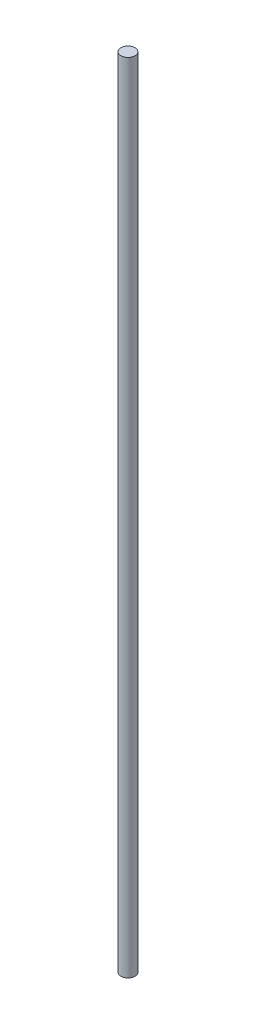
ISO-10303-21;
HEADER;
FILE_DESCRIPTION(('STEP AP214'),'2;1');
FILE_NAME('part.step','',(''),(''),'','','');
FILE_SCHEMA(('AUTOMOTIVE_DESIGN { 1 0 10303 214 1 1 1 1 }'));
ENDSEC;
DATA;
#1=APPLICATION_CONTEXT('core data for automotive mechanical design processes');
#2=APPLICATION_PROTOCOL_DEFINITION('international standard','automotive_design',2000,#1);
#3=PRODUCT_CONTEXT('',#1,'mechanical');
#4=PRODUCT('Part','Part','',(#3));
#5=PRODUCT_RELATED_PRODUCT_CATEGORY('part','',(#4));
#6=PRODUCT_DEFINITION_FORMATION('','',#4);
#7=PRODUCT_DEFINITION_CONTEXT('part definition',#1,'design');
#8=PRODUCT_DEFINITION('design','',#6,#7);
#9=PRODUCT_DEFINITION_SHAPE('','',#8);
#10=(LENGTH_UNIT() NAMED_UNIT(*) SI_UNIT(.MILLI.,.METRE.));
#11=(NAMED_UNIT(*) PLANE_ANGLE_UNIT() SI_UNIT($,.RADIAN.));
#12=(NAMED_UNIT(*) SI_UNIT($,.STERADIAN.) SOLID_ANGLE_UNIT());
#13=UNCERTAINTY_MEASURE_WITH_UNIT(LENGTH_MEASURE(1.E-05),#10,'distance_accuracy_value','');
#14=(GEOMETRIC_REPRESENTATION_CONTEXT(3) GLOBAL_UNCERTAINTY_ASSIGNED_CONTEXT((#13)) GLOBAL_UNIT_ASSIGNED_CONTEXT((#10,
#11,#12)) REPRESENTATION_CONTEXT('',''));
#15=CARTESIAN_POINT('',(0.,0.,0.));
#16=DIRECTION('',(0.,0.,1.));
#17=DIRECTION('',(1.,0.,0.));
#18=AXIS2_PLACEMENT_3D('',#15,#16,#17);
#19=CARTESIAN_POINT('',(0.,454.9,0.));
#20=DIRECTION('',(0.,-1.,0.));
#21=DIRECTION('',(0.,0.,-1.));
#22=AXIS2_PLACEMENT_3D('',#19,#20,#21);
#23=CYLINDRICAL_SURFACE('',#22,4.);
#24=CARTESIAN_POINT('',(0.,454.9,0.));
#25=DIRECTION('',(0.,1.,0.));
#26=DIRECTION('',(0.,0.,1.));
#27=AXIS2_PLACEMENT_3D('',#24,#25,#26);
#28=CIRCLE('',#27,4.);
#29=CARTESIAN_POINT('',(0.,454.9,4.));
#30=VERTEX_POINT('',#29);
#31=EDGE_CURVE('E10',#30,#30,#28,.T.);
#32=ORIENTED_EDGE('',*,*,#31,.F.);
#33=EDGE_LOOP('',(#32));
#34=FACE_BOUND('',#33,.T.);
#35=CARTESIAN_POINT('',(0.,0.,0.));
#36=DIRECTION('',(0.,1.,0.));
#37=DIRECTION('',(0.,0.,1.));
#38=AXIS2_PLACEMENT_3D('',#35,#36,#37);
#39=CIRCLE('',#38,4.);
#40=CARTESIAN_POINT('',(0.,0.,4.));
#41=VERTEX_POINT('',#40);
#42=EDGE_CURVE('E36',#41,#41,#39,.T.);
#43=ORIENTED_EDGE('',*,*,#42,.T.);
#44=EDGE_LOOP('',(#43));
#45=FACE_BOUND('',#44,.T.);
#46=ADVANCED_FACE('F33',(#34,#45),#23,.T.);
#47=CARTESIAN_POINT('',(0.,454.9,0.));
#48=DIRECTION('',(0.,1.,0.));
#49=DIRECTION('',(0.,0.,1.));
#50=AXIS2_PLACEMENT_3D('',#47,#48,#49);
#51=PLANE('',#50);
#52=ORIENTED_EDGE('',*,*,#31,.T.);
#53=EDGE_LOOP('',(#52));
#54=FACE_BOUND('',#53,.T.);
#55=ADVANCED_FACE('F48',(#54),#51,.T.);
#56=CARTESIAN_POINT('',(0.,0.,0.));
#57=DIRECTION('',(0.,1.,0.));
#58=DIRECTION('',(0.,0.,1.));
#59=AXIS2_PLACEMENT_3D('',#56,#57,#58);
#60=PLANE('',#59);
#61=ORIENTED_EDGE('',*,*,#42,.F.);
#62=EDGE_LOOP('',(#61));
#63=FACE_BOUND('',#62,.T.);
#64=ADVANCED_FACE('F46',(#63),#60,.F.);
#65=CLOSED_SHELL('',(#46,#55,#64));
#66=MANIFOLD_SOLID_BREP('B2',#65);
#67=ADVANCED_BREP_SHAPE_REPRESENTATION('',(#18,#66),#14);
#68=SHAPE_DEFINITION_REPRESENTATION(#9,#67);
ENDSEC;
END-ISO-10303-21;
